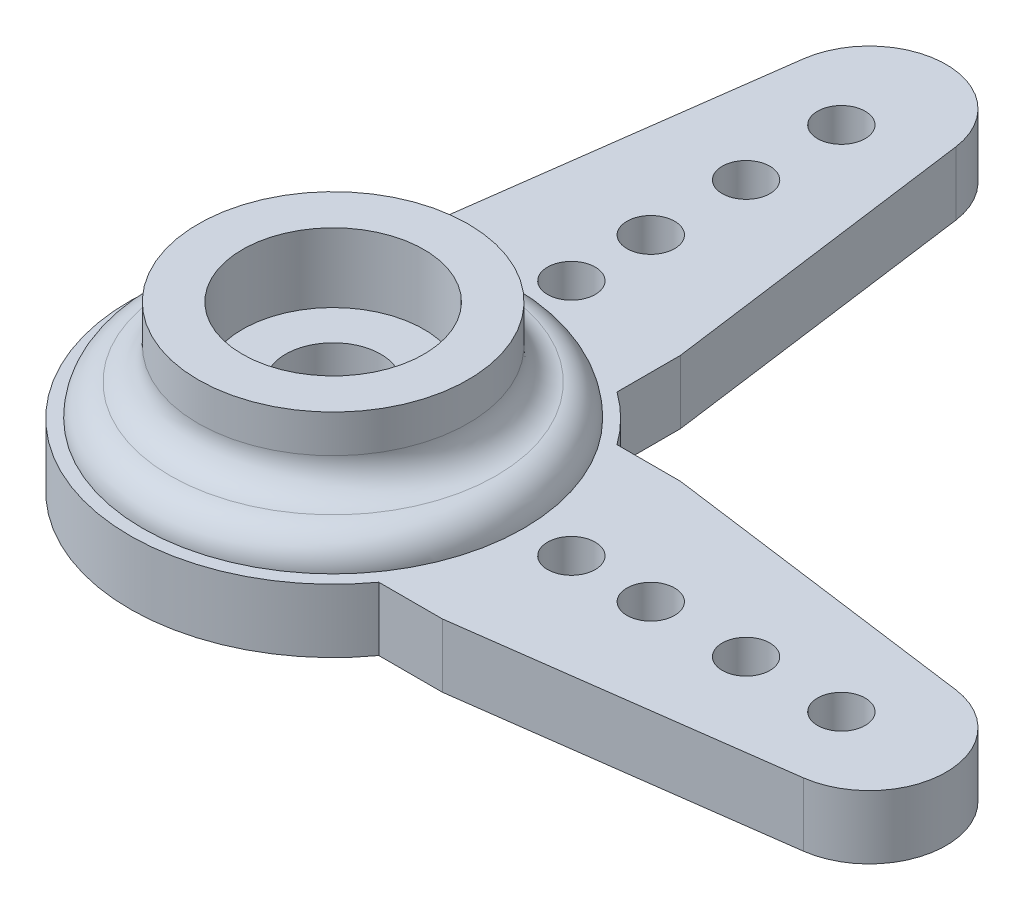
ISO-10303-21;
HEADER;
FILE_DESCRIPTION(('STEP AP214'),'2;1');
FILE_NAME('part.step','',(''),(''),'','','');
FILE_SCHEMA(('AUTOMOTIVE_DESIGN { 1 0 10303 214 1 1 1 1 }'));
ENDSEC;
DATA;
#1=APPLICATION_CONTEXT('core data for automotive mechanical design processes');
#2=APPLICATION_PROTOCOL_DEFINITION('international standard','automotive_design',2000,#1);
#3=PRODUCT_CONTEXT('',#1,'mechanical');
#4=PRODUCT('Part','Part','',(#3));
#5=PRODUCT_RELATED_PRODUCT_CATEGORY('part','',(#4));
#6=PRODUCT_DEFINITION_FORMATION('','',#4);
#7=PRODUCT_DEFINITION_CONTEXT('part definition',#1,'design');
#8=PRODUCT_DEFINITION('design','',#6,#7);
#9=PRODUCT_DEFINITION_SHAPE('','',#8);
#10=(LENGTH_UNIT() NAMED_UNIT(*) SI_UNIT(.MILLI.,.METRE.));
#11=(NAMED_UNIT(*) PLANE_ANGLE_UNIT() SI_UNIT($,.RADIAN.));
#12=(NAMED_UNIT(*) SI_UNIT($,.STERADIAN.) SOLID_ANGLE_UNIT());
#13=UNCERTAINTY_MEASURE_WITH_UNIT(LENGTH_MEASURE(1.E-05),#10,'distance_accuracy_value','');
#14=(GEOMETRIC_REPRESENTATION_CONTEXT(3) GLOBAL_UNCERTAINTY_ASSIGNED_CONTEXT((#13)) GLOBAL_UNIT_ASSIGNED_CONTEXT((#10,
#11,#12)) REPRESENTATION_CONTEXT('',''));
#15=CARTESIAN_POINT('',(0.,0.,0.));
#16=DIRECTION('',(0.,0.,1.));
#17=DIRECTION('',(1.,0.,0.));
#18=AXIS2_PLACEMENT_3D('',#15,#16,#17);
#19=CARTESIAN_POINT('',(0.,2.,0.));
#20=DIRECTION('',(0.,1.,0.));
#21=DIRECTION('',(0.,0.,1.));
#22=AXIS2_PLACEMENT_3D('',#19,#20,#21);
#23=PLANE('',#22);
#24=CARTESIAN_POINT('',(7.5,2.,0.));
#25=DIRECTION('',(0.,1.,0.));
#26=DIRECTION('',(0.,0.,1.));
#27=AXIS2_PLACEMENT_3D('',#24,#25,#26);
#28=CIRCLE('',#27,0.75);
#29=CARTESIAN_POINT('',(7.5,2.,0.750000000000026));
#30=VERTEX_POINT('',#29);
#31=EDGE_CURVE('E363',#30,#30,#28,.T.);
#32=ORIENTED_EDGE('',*,*,#31,.F.);
#33=EDGE_LOOP('',(#32));
#34=FACE_BOUND('',#33,.T.);
#35=CARTESIAN_POINT('',(13.,2.,0.));
#36=DIRECTION('',(0.,1.,0.));
#37=DIRECTION('',(0.,0.,1.));
#38=AXIS2_PLACEMENT_3D('',#35,#36,#37);
#39=CIRCLE('',#38,0.750000000000001);
#40=CARTESIAN_POINT('',(13.,2.,0.750000000000046));
#41=VERTEX_POINT('',#40);
#42=EDGE_CURVE('E351',#41,#41,#39,.T.);
#43=ORIENTED_EDGE('',*,*,#42,.F.);
#44=EDGE_LOOP('',(#43));
#45=FACE_BOUND('',#44,.T.);
#46=CARTESIAN_POINT('',(0.,2.,-7.5));
#47=DIRECTION('',(0.,1.,0.));
#48=DIRECTION('',(0.,0.,1.));
#49=AXIS2_PLACEMENT_3D('',#46,#47,#48);
#50=CIRCLE('',#49,0.75);
#51=CARTESIAN_POINT('',(0.,2.,-6.75));
#52=VERTEX_POINT('',#51);
#53=EDGE_CURVE('E339',#52,#52,#50,.T.);
#54=ORIENTED_EDGE('',*,*,#53,.F.);
#55=EDGE_LOOP('',(#54));
#56=FACE_BOUND('',#55,.T.);
#57=CARTESIAN_POINT('',(0.,2.,-13.));
#58=DIRECTION('',(0.,1.,0.));
#59=DIRECTION('',(0.,0.,1.));
#60=AXIS2_PLACEMENT_3D('',#57,#58,#59);
#61=CIRCLE('',#60,0.750000000000001);
#62=CARTESIAN_POINT('',(0.,2.,-12.25));
#63=VERTEX_POINT('',#62);
#64=EDGE_CURVE('E327',#63,#63,#61,.T.);
#65=ORIENTED_EDGE('',*,*,#64,.F.);
#66=EDGE_LOOP('',(#65));
#67=FACE_BOUND('',#66,.T.);
#68=CARTESIAN_POINT('',(0.,2.,0.));
#69=DIRECTION('',(0.,1.,0.));
#70=DIRECTION('',(0.,0.,1.));
#71=AXIS2_PLACEMENT_3D('',#68,#69,#70);
#72=CIRCLE('',#71,6.4);
#73=CARTESIAN_POINT('',(-3.75,2.,-5.18627997701628));
#74=VERTEX_POINT('',#73);
#75=CARTESIAN_POINT('',(5.18627997701627,2.,3.75000000000002));
#76=VERTEX_POINT('',#75);
#77=EDGE_CURVE('E179',#74,#76,#72,.T.);
#78=ORIENTED_EDGE('',*,*,#77,.T.);
#79=DIRECTION('',(1.,0.,0.));
#80=VECTOR('',#79,1.);
#81=CARTESIAN_POINT('',(5.18627997701627,2.,3.75000000000002));
#82=LINE('',#81,#80);
#83=CARTESIAN_POINT('',(7.18627997701627,2.,3.75000000000002));
#84=VERTEX_POINT('',#83);
#85=EDGE_CURVE('E107',#76,#84,#82,.T.);
#86=ORIENTED_EDGE('',*,*,#85,.T.);
#87=DIRECTION('',(0.99103765023662,0.,-0.1335828425116));
#88=VECTOR('',#87,1.);
#89=CARTESIAN_POINT('',(7.18627997701627,2.,3.75000000000002));
#90=LINE('',#89,#88);
#91=CARTESIAN_POINT('',(17.2017939656726,2.,2.40000000000006));
#92=VERTEX_POINT('',#91);
#93=EDGE_CURVE('E291',#84,#92,#90,.T.);
#94=ORIENTED_EDGE('',*,*,#93,.T.);
#95=CARTESIAN_POINT('',(16.8782958402973,2.,0.));
#96=DIRECTION('',(0.,1.,0.));
#97=DIRECTION('',(0.,0.,-1.));
#98=AXIS2_PLACEMENT_3D('',#95,#96,#97);
#99=CIRCLE('',#98,2.42170415970269);
#100=CARTESIAN_POINT('',(17.2017939656726,2.,-2.39999999999994));
#101=VERTEX_POINT('',#100);
#102=EDGE_CURVE('E293',#92,#101,#99,.T.);
#103=ORIENTED_EDGE('',*,*,#102,.T.);
#104=DIRECTION('',(-0.991037650236619,0.,-0.133582842511607));
#105=VECTOR('',#104,1.);
#106=CARTESIAN_POINT('',(7.18627997701629,2.,-3.74999999999997));
#107=LINE('',#106,#105);
#108=CARTESIAN_POINT('',(7.18627997701629,2.,-3.74999999999997));
#109=VERTEX_POINT('',#108);
#110=EDGE_CURVE('E295',#101,#109,#107,.T.);
#111=ORIENTED_EDGE('',*,*,#110,.T.);
#112=DIRECTION('',(-1.,0.,0.));
#113=VECTOR('',#112,1.);
#114=CARTESIAN_POINT('',(5.18627997701629,2.,-3.74999999999998));
#115=LINE('',#114,#113);
#116=CARTESIAN_POINT('',(5.18627997701629,2.,-3.74999999999998));
#117=VERTEX_POINT('',#116);
#118=EDGE_CURVE('E301',#109,#117,#115,.T.);
#119=ORIENTED_EDGE('',*,*,#118,.T.);
#120=CARTESIAN_POINT('',(0.,2.,0.));
#121=DIRECTION('',(0.,1.,0.));
#122=DIRECTION('',(0.,0.,1.));
#123=AXIS2_PLACEMENT_3D('',#120,#121,#122);
#124=CIRCLE('',#123,6.4);
#125=CARTESIAN_POINT('',(3.75,2.,-5.18627997701628));
#126=VERTEX_POINT('',#125);
#127=EDGE_CURVE('E303',#117,#126,#124,.T.);
#128=ORIENTED_EDGE('',*,*,#127,.T.);
#129=DIRECTION('',(0.,0.,-1.));
#130=VECTOR('',#129,1.);
#131=CARTESIAN_POINT('',(3.75,2.,-5.18627997701628));
#132=LINE('',#131,#130);
#133=CARTESIAN_POINT('',(3.75,2.,-7.18627997701628));
#134=VERTEX_POINT('',#133);
#135=EDGE_CURVE('E305',#126,#134,#132,.T.);
#136=ORIENTED_EDGE('',*,*,#135,.T.);
#137=DIRECTION('',(-0.133582842511604,0.,-0.991037650236619));
#138=VECTOR('',#137,1.);
#139=CARTESIAN_POINT('',(3.75,2.,-7.18627997701628));
#140=LINE('',#139,#138);
#141=CARTESIAN_POINT('',(2.4,2.,-17.2017939656726));
#142=VERTEX_POINT('',#141);
#143=EDGE_CURVE('E138',#134,#142,#140,.T.);
#144=ORIENTED_EDGE('',*,*,#143,.T.);
#145=CARTESIAN_POINT('',(0.,2.,-16.8782958402973));
#146=DIRECTION('',(0.,1.,0.));
#147=DIRECTION('',(0.,0.,-1.));
#148=AXIS2_PLACEMENT_3D('',#145,#146,#147);
#149=CIRCLE('',#148,2.42170415970269);
#150=CARTESIAN_POINT('',(-2.4,2.,-17.2017939656726));
#151=VERTEX_POINT('',#150);
#152=EDGE_CURVE('E132',#142,#151,#149,.T.);
#153=ORIENTED_EDGE('',*,*,#152,.T.);
#154=DIRECTION('',(-0.133582842511604,0.,0.991037650236619));
#155=VECTOR('',#154,1.);
#156=CARTESIAN_POINT('',(-3.75,2.,-7.18627997701628));
#157=LINE('',#156,#155);
#158=CARTESIAN_POINT('',(-3.75,2.,-7.18627997701628));
#159=VERTEX_POINT('',#158);
#160=EDGE_CURVE('E136',#151,#159,#157,.T.);
#161=ORIENTED_EDGE('',*,*,#160,.T.);
#162=DIRECTION('',(0.,0.,1.));
#163=VECTOR('',#162,1.);
#164=CARTESIAN_POINT('',(-3.75,2.,-5.18627997701628));
#165=LINE('',#164,#163);
#166=EDGE_CURVE('E51',#159,#74,#165,.T.);
#167=ORIENTED_EDGE('',*,*,#166,.T.);
#168=EDGE_LOOP('',(#78,#86,#94,#103,#111,#119,#128,#136,#144,#153,#161,#167));
#169=FACE_BOUND('',#168,.T.);
#170=CARTESIAN_POINT('',(0.,2.,-16.));
#171=DIRECTION('',(0.,1.,0.));
#172=DIRECTION('',(0.,0.,1.));
#173=AXIS2_PLACEMENT_3D('',#170,#171,#172);
#174=CIRCLE('',#173,0.750000000000001);
#175=CARTESIAN_POINT('',(0.,2.,-15.25));
#176=VERTEX_POINT('',#175);
#177=EDGE_CURVE('E323',#176,#176,#174,.T.);
#178=ORIENTED_EDGE('',*,*,#177,.F.);
#179=EDGE_LOOP('',(#178));
#180=FACE_BOUND('',#179,.T.);
#181=CARTESIAN_POINT('',(0.,2.,-10.));
#182=DIRECTION('',(0.,1.,0.));
#183=DIRECTION('',(0.,0.,1.));
#184=AXIS2_PLACEMENT_3D('',#181,#182,#183);
#185=CIRCLE('',#184,0.750000000000001);
#186=CARTESIAN_POINT('',(0.,2.,-9.25));
#187=VERTEX_POINT('',#186);
#188=EDGE_CURVE('E333',#187,#187,#185,.T.);
#189=ORIENTED_EDGE('',*,*,#188,.F.);
#190=EDGE_LOOP('',(#189));
#191=FACE_BOUND('',#190,.T.);
#192=CARTESIAN_POINT('',(16.,2.,0.));
#193=DIRECTION('',(0.,1.,0.));
#194=DIRECTION('',(0.,0.,1.));
#195=AXIS2_PLACEMENT_3D('',#192,#193,#194);
#196=CIRCLE('',#195,0.749999999999999);
#197=CARTESIAN_POINT('',(16.,2.,0.750000000000055));
#198=VERTEX_POINT('',#197);
#199=EDGE_CURVE('E345',#198,#198,#196,.T.);
#200=ORIENTED_EDGE('',*,*,#199,.F.);
#201=EDGE_LOOP('',(#200));
#202=FACE_BOUND('',#201,.T.);
#203=CARTESIAN_POINT('',(10.,2.,0.));
#204=DIRECTION('',(0.,1.,0.));
#205=DIRECTION('',(0.,0.,1.));
#206=AXIS2_PLACEMENT_3D('',#203,#204,#205);
#207=CIRCLE('',#206,0.750000000000001);
#208=CARTESIAN_POINT('',(10.,2.,0.750000000000036));
#209=VERTEX_POINT('',#208);
#210=EDGE_CURVE('E357',#209,#209,#207,.T.);
#211=ORIENTED_EDGE('',*,*,#210,.F.);
#212=EDGE_LOOP('',(#211));
#213=FACE_BOUND('',#212,.T.);
#214=CARTESIAN_POINT('',(0.,2.,0.));
#215=DIRECTION('',(0.,1.,0.));
#216=DIRECTION('',(0.,0.,1.));
#217=AXIS2_PLACEMENT_3D('',#214,#215,#216);
#218=CIRCLE('',#217,6.);
#219=CARTESIAN_POINT('',(0.,2.,6.));
#220=VERTEX_POINT('',#219);
#221=EDGE_CURVE('E377',#220,#220,#218,.T.);
#222=ORIENTED_EDGE('',*,*,#221,.F.);
#223=EDGE_LOOP('',(#222));
#224=FACE_BOUND('',#223,.T.);
#225=ADVANCED_FACE('F33',(#34,#45,#56,#67,#169,#180,#191,#202,#213,#224),#23,.T.);
#226=CARTESIAN_POINT('',(0.,0.,0.));
#227=DIRECTION('',(0.,1.,0.));
#228=DIRECTION('',(0.,0.,1.));
#229=AXIS2_PLACEMENT_3D('',#226,#227,#228);
#230=PLANE('',#229);
#231=CARTESIAN_POINT('',(10.,0.,0.));
#232=DIRECTION('',(0.,1.,0.));
#233=DIRECTION('',(0.,0.,1.));
#234=AXIS2_PLACEMENT_3D('',#231,#232,#233);
#235=CIRCLE('',#234,0.750000000000001);
#236=CARTESIAN_POINT('',(10.,0.,0.750000000000036));
#237=VERTEX_POINT('',#236);
#238=EDGE_CURVE('E360',#237,#237,#235,.T.);
#239=ORIENTED_EDGE('',*,*,#238,.T.);
#240=EDGE_LOOP('',(#239));
#241=FACE_BOUND('',#240,.T.);
#242=CARTESIAN_POINT('',(16.,0.,0.));
#243=DIRECTION('',(0.,1.,0.));
#244=DIRECTION('',(0.,0.,1.));
#245=AXIS2_PLACEMENT_3D('',#242,#243,#244);
#246=CIRCLE('',#245,0.749999999999999);
#247=CARTESIAN_POINT('',(16.,0.,0.750000000000055));
#248=VERTEX_POINT('',#247);
#249=EDGE_CURVE('E348',#248,#248,#246,.T.);
#250=ORIENTED_EDGE('',*,*,#249,.T.);
#251=EDGE_LOOP('',(#250));
#252=FACE_BOUND('',#251,.T.);
#253=CARTESIAN_POINT('',(0.,0.,-10.));
#254=DIRECTION('',(0.,1.,0.));
#255=DIRECTION('',(0.,0.,1.));
#256=AXIS2_PLACEMENT_3D('',#253,#254,#255);
#257=CIRCLE('',#256,0.750000000000001);
#258=CARTESIAN_POINT('',(0.,0.,-9.25));
#259=VERTEX_POINT('',#258);
#260=EDGE_CURVE('E336',#259,#259,#257,.T.);
#261=ORIENTED_EDGE('',*,*,#260,.T.);
#262=EDGE_LOOP('',(#261));
#263=FACE_BOUND('',#262,.T.);
#264=CARTESIAN_POINT('',(0.,0.,-16.));
#265=DIRECTION('',(0.,1.,0.));
#266=DIRECTION('',(0.,0.,1.));
#267=AXIS2_PLACEMENT_3D('',#264,#265,#266);
#268=CIRCLE('',#267,0.750000000000001);
#269=CARTESIAN_POINT('',(0.,0.,-15.25));
#270=VERTEX_POINT('',#269);
#271=EDGE_CURVE('E324',#270,#270,#268,.T.);
#272=ORIENTED_EDGE('',*,*,#271,.T.);
#273=EDGE_LOOP('',(#272));
#274=FACE_BOUND('',#273,.T.);
#275=CARTESIAN_POINT('',(0.,0.,0.));
#276=DIRECTION('',(0.,1.,0.));
#277=DIRECTION('',(0.,0.,1.));
#278=AXIS2_PLACEMENT_3D('',#275,#276,#277);
#279=CIRCLE('',#278,6.4);
#280=CARTESIAN_POINT('',(-3.75,0.,-5.18627997701628));
#281=VERTEX_POINT('',#280);
#282=CARTESIAN_POINT('',(5.18627997701627,0.,3.75000000000002));
#283=VERTEX_POINT('',#282);
#284=EDGE_CURVE('E156',#281,#283,#279,.T.);
#285=ORIENTED_EDGE('',*,*,#284,.F.);
#286=DIRECTION('',(0.,0.,1.));
#287=VECTOR('',#286,1.);
#288=CARTESIAN_POINT('',(-3.75,0.,-5.18627997701628));
#289=LINE('',#288,#287);
#290=CARTESIAN_POINT('',(-3.75,0.,-7.18627997701628));
#291=VERTEX_POINT('',#290);
#292=EDGE_CURVE('E98',#291,#281,#289,.T.);
#293=ORIENTED_EDGE('',*,*,#292,.F.);
#294=DIRECTION('',(-0.133582842511604,0.,0.991037650236619));
#295=VECTOR('',#294,1.);
#296=CARTESIAN_POINT('',(-3.75,0.,-7.18627997701628));
#297=LINE('',#296,#295);
#298=CARTESIAN_POINT('',(-2.4,0.,-17.2017939656726));
#299=VERTEX_POINT('',#298);
#300=EDGE_CURVE('E92',#299,#291,#297,.T.);
#301=ORIENTED_EDGE('',*,*,#300,.F.);
#302=CARTESIAN_POINT('',(0.,0.,-16.8782958402973));
#303=DIRECTION('',(0.,1.,0.));
#304=DIRECTION('',(0.,0.,-1.));
#305=AXIS2_PLACEMENT_3D('',#302,#303,#304);
#306=CIRCLE('',#305,2.42170415970269);
#307=CARTESIAN_POINT('',(2.4,0.,-17.2017939656726));
#308=VERTEX_POINT('',#307);
#309=EDGE_CURVE('E146',#308,#299,#306,.T.);
#310=ORIENTED_EDGE('',*,*,#309,.F.);
#311=DIRECTION('',(-0.133582842511604,0.,-0.991037650236619));
#312=VECTOR('',#311,1.);
#313=CARTESIAN_POINT('',(3.75,0.,-7.18627997701628));
#314=LINE('',#313,#312);
#315=CARTESIAN_POINT('',(3.75,0.,-7.18627997701628));
#316=VERTEX_POINT('',#315);
#317=EDGE_CURVE('E174',#316,#308,#314,.T.);
#318=ORIENTED_EDGE('',*,*,#317,.F.);
#319=DIRECTION('',(0.,0.,-1.));
#320=VECTOR('',#319,1.);
#321=CARTESIAN_POINT('',(3.75,0.,-5.18627997701628));
#322=LINE('',#321,#320);
#323=CARTESIAN_POINT('',(3.75,0.,-5.18627997701628));
#324=VERTEX_POINT('',#323);
#325=EDGE_CURVE('E172',#324,#316,#322,.T.);
#326=ORIENTED_EDGE('',*,*,#325,.F.);
#327=CARTESIAN_POINT('',(0.,0.,0.));
#328=DIRECTION('',(0.,1.,0.));
#329=DIRECTION('',(0.,0.,1.));
#330=AXIS2_PLACEMENT_3D('',#327,#328,#329);
#331=CIRCLE('',#330,6.4);
#332=CARTESIAN_POINT('',(5.18627997701629,0.,-3.74999999999998));
#333=VERTEX_POINT('',#332);
#334=EDGE_CURVE('E170',#333,#324,#331,.T.);
#335=ORIENTED_EDGE('',*,*,#334,.F.);
#336=DIRECTION('',(-1.,0.,0.));
#337=VECTOR('',#336,1.);
#338=CARTESIAN_POINT('',(5.18627997701629,0.,-3.74999999999998));
#339=LINE('',#338,#337);
#340=CARTESIAN_POINT('',(7.18627997701629,0.,-3.74999999999997));
#341=VERTEX_POINT('',#340);
#342=EDGE_CURVE('E168',#341,#333,#339,.T.);
#343=ORIENTED_EDGE('',*,*,#342,.F.);
#344=DIRECTION('',(-0.991037650236619,0.,-0.133582842511607));
#345=VECTOR('',#344,1.);
#346=CARTESIAN_POINT('',(7.18627997701629,0.,-3.74999999999997));
#347=LINE('',#346,#345);
#348=CARTESIAN_POINT('',(17.2017939656726,0.,-2.39999999999994));
#349=VERTEX_POINT('',#348);
#350=EDGE_CURVE('E166',#349,#341,#347,.T.);
#351=ORIENTED_EDGE('',*,*,#350,.F.);
#352=CARTESIAN_POINT('',(16.8782958402973,0.,0.));
#353=DIRECTION('',(0.,1.,0.));
#354=DIRECTION('',(0.,0.,-1.));
#355=AXIS2_PLACEMENT_3D('',#352,#353,#354);
#356=CIRCLE('',#355,2.42170415970269);
#357=CARTESIAN_POINT('',(17.2017939656726,0.,2.40000000000006));
#358=VERTEX_POINT('',#357);
#359=EDGE_CURVE('E164',#358,#349,#356,.T.);
#360=ORIENTED_EDGE('',*,*,#359,.F.);
#361=DIRECTION('',(0.99103765023662,0.,-0.1335828425116));
#362=VECTOR('',#361,1.);
#363=CARTESIAN_POINT('',(7.18627997701627,0.,3.75000000000002));
#364=LINE('',#363,#362);
#365=CARTESIAN_POINT('',(7.18627997701627,0.,3.75000000000002));
#366=VERTEX_POINT('',#365);
#367=EDGE_CURVE('E162',#366,#358,#364,.T.);
#368=ORIENTED_EDGE('',*,*,#367,.F.);
#369=DIRECTION('',(1.,0.,0.));
#370=VECTOR('',#369,1.);
#371=CARTESIAN_POINT('',(5.18627997701627,0.,3.75000000000002));
#372=LINE('',#371,#370);
#373=EDGE_CURVE('E159',#283,#366,#372,.T.);
#374=ORIENTED_EDGE('',*,*,#373,.F.);
#375=EDGE_LOOP('',(#285,#293,#301,#310,#318,#326,#335,#343,#351,#360,#368,#374));
#376=FACE_BOUND('',#375,.T.);
#377=CARTESIAN_POINT('',(0.,0.,0.));
#378=DIRECTION('',(0.,1.,0.));
#379=DIRECTION('',(0.,0.,1.));
#380=AXIS2_PLACEMENT_3D('',#377,#378,#379);
#381=CIRCLE('',#380,1.5);
#382=CARTESIAN_POINT('',(0.,0.,1.5));
#383=VERTEX_POINT('',#382);
#384=EDGE_CURVE('E160',#383,#383,#381,.T.);
#385=ORIENTED_EDGE('',*,*,#384,.T.);
#386=EDGE_LOOP('',(#385));
#387=FACE_BOUND('',#386,.T.);
#388=CARTESIAN_POINT('',(0.,0.,-13.));
#389=DIRECTION('',(0.,1.,0.));
#390=DIRECTION('',(0.,0.,1.));
#391=AXIS2_PLACEMENT_3D('',#388,#389,#390);
#392=CIRCLE('',#391,0.750000000000001);
#393=CARTESIAN_POINT('',(0.,0.,-12.25));
#394=VERTEX_POINT('',#393);
#395=EDGE_CURVE('E330',#394,#394,#392,.T.);
#396=ORIENTED_EDGE('',*,*,#395,.T.);
#397=EDGE_LOOP('',(#396));
#398=FACE_BOUND('',#397,.T.);
#399=CARTESIAN_POINT('',(0.,0.,-7.5));
#400=DIRECTION('',(0.,1.,0.));
#401=DIRECTION('',(0.,0.,1.));
#402=AXIS2_PLACEMENT_3D('',#399,#400,#401);
#403=CIRCLE('',#402,0.75);
#404=CARTESIAN_POINT('',(0.,0.,-6.75));
#405=VERTEX_POINT('',#404);
#406=EDGE_CURVE('E342',#405,#405,#403,.T.);
#407=ORIENTED_EDGE('',*,*,#406,.T.);
#408=EDGE_LOOP('',(#407));
#409=FACE_BOUND('',#408,.T.);
#410=CARTESIAN_POINT('',(13.,0.,0.));
#411=DIRECTION('',(0.,1.,0.));
#412=DIRECTION('',(0.,0.,1.));
#413=AXIS2_PLACEMENT_3D('',#410,#411,#412);
#414=CIRCLE('',#413,0.750000000000001);
#415=CARTESIAN_POINT('',(13.,0.,0.750000000000046));
#416=VERTEX_POINT('',#415);
#417=EDGE_CURVE('E354',#416,#416,#414,.T.);
#418=ORIENTED_EDGE('',*,*,#417,.T.);
#419=EDGE_LOOP('',(#418));
#420=FACE_BOUND('',#419,.T.);
#421=CARTESIAN_POINT('',(7.5,0.,0.));
#422=DIRECTION('',(0.,1.,0.));
#423=DIRECTION('',(0.,0.,1.));
#424=AXIS2_PLACEMENT_3D('',#421,#422,#423);
#425=CIRCLE('',#424,0.75);
#426=CARTESIAN_POINT('',(7.5,0.,0.750000000000026));
#427=VERTEX_POINT('',#426);
#428=EDGE_CURVE('E366',#427,#427,#425,.T.);
#429=ORIENTED_EDGE('',*,*,#428,.T.);
#430=EDGE_LOOP('',(#429));
#431=FACE_BOUND('',#430,.T.);
#432=ADVANCED_FACE('F225',(#241,#252,#263,#274,#376,#387,#398,#409,#420,#431),#230,.F.);
#433=CARTESIAN_POINT('',(0.,2.,0.));
#434=DIRECTION('',(0.,-1.,0.));
#435=DIRECTION('',(0.,0.,-1.));
#436=AXIS2_PLACEMENT_3D('',#433,#434,#435);
#437=CYLINDRICAL_SURFACE('',#436,6.4);
#438=ORIENTED_EDGE('',*,*,#284,.T.);
#439=DIRECTION('',(0.,-1.,0.));
#440=VECTOR('',#439,1.);
#441=CARTESIAN_POINT('',(5.18627997701627,2.,3.75000000000002));
#442=LINE('',#441,#440);
#443=EDGE_CURVE('E204',#76,#283,#442,.T.);
#444=ORIENTED_EDGE('',*,*,#443,.F.);
#445=ORIENTED_EDGE('',*,*,#77,.F.);
#446=DIRECTION('',(0.,-1.,0.));
#447=VECTOR('',#446,1.);
#448=CARTESIAN_POINT('',(-3.75,2.,-5.18627997701628));
#449=LINE('',#448,#447);
#450=EDGE_CURVE('E152',#74,#281,#449,.T.);
#451=ORIENTED_EDGE('',*,*,#450,.T.);
#452=EDGE_LOOP('',(#438,#444,#445,#451));
#453=FACE_BOUND('',#452,.T.);
#454=ADVANCED_FACE('F231',(#453),#437,.T.);
#455=CARTESIAN_POINT('',(5.18627997701627,2.,3.75000000000002));
#456=DIRECTION('',(0.,0.,-1.));
#457=DIRECTION('',(-1.,0.,0.));
#458=AXIS2_PLACEMENT_3D('',#455,#456,#457);
#459=PLANE('',#458);
#460=ORIENTED_EDGE('',*,*,#373,.T.);
#461=DIRECTION('',(0.,-1.,0.));
#462=VECTOR('',#461,1.);
#463=CARTESIAN_POINT('',(7.18627997701627,2.,3.75000000000002));
#464=LINE('',#463,#462);
#465=EDGE_CURVE('E201',#84,#366,#464,.T.);
#466=ORIENTED_EDGE('',*,*,#465,.F.);
#467=ORIENTED_EDGE('',*,*,#85,.F.);
#468=ORIENTED_EDGE('',*,*,#443,.T.);
#469=EDGE_LOOP('',(#460,#466,#467,#468));
#470=FACE_BOUND('',#469,.T.);
#471=ADVANCED_FACE('F274',(#470),#459,.F.);
#472=CARTESIAN_POINT('',(7.18627997701627,2.,3.75000000000002));
#473=DIRECTION('',(-0.1335828425116,0.,-0.99103765023662));
#474=DIRECTION('',(-0.99103765023662,0.,0.1335828425116));
#475=AXIS2_PLACEMENT_3D('',#472,#473,#474);
#476=PLANE('',#475);
#477=ORIENTED_EDGE('',*,*,#367,.T.);
#478=DIRECTION('',(0.,-1.,0.));
#479=VECTOR('',#478,1.);
#480=CARTESIAN_POINT('',(17.2017939656726,2.,2.40000000000006));
#481=LINE('',#480,#479);
#482=EDGE_CURVE('E198',#92,#358,#481,.T.);
#483=ORIENTED_EDGE('',*,*,#482,.F.);
#484=ORIENTED_EDGE('',*,*,#93,.F.);
#485=ORIENTED_EDGE('',*,*,#465,.T.);
#486=EDGE_LOOP('',(#477,#483,#484,#485));
#487=FACE_BOUND('',#486,.T.);
#488=ADVANCED_FACE('F270',(#487),#476,.F.);
#489=CARTESIAN_POINT('',(16.8782958402973,2.,0.));
#490=DIRECTION('',(0.,-1.,0.));
#491=DIRECTION('',(0.,0.,-1.));
#492=AXIS2_PLACEMENT_3D('',#489,#490,#491);
#493=CYLINDRICAL_SURFACE('',#492,2.42170415970269);
#494=ORIENTED_EDGE('',*,*,#359,.T.);
#495=DIRECTION('',(0.,-1.,0.));
#496=VECTOR('',#495,1.);
#497=CARTESIAN_POINT('',(17.2017939656726,2.,-2.39999999999994));
#498=LINE('',#497,#496);
#499=EDGE_CURVE('E195',#101,#349,#498,.T.);
#500=ORIENTED_EDGE('',*,*,#499,.F.);
#501=ORIENTED_EDGE('',*,*,#102,.F.);
#502=ORIENTED_EDGE('',*,*,#482,.T.);
#503=EDGE_LOOP('',(#494,#500,#501,#502));
#504=FACE_BOUND('',#503,.T.);
#505=ADVANCED_FACE('F266',(#504),#493,.T.);
#506=CARTESIAN_POINT('',(7.18627997701629,2.,-3.74999999999997));
#507=DIRECTION('',(-0.133582842511607,0.,0.991037650236619));
#508=DIRECTION('',(0.991037650236619,0.,0.133582842511607));
#509=AXIS2_PLACEMENT_3D('',#506,#507,#508);
#510=PLANE('',#509);
#511=ORIENTED_EDGE('',*,*,#350,.T.);
#512=DIRECTION('',(0.,-1.,0.));
#513=VECTOR('',#512,1.);
#514=CARTESIAN_POINT('',(7.18627997701629,2.,-3.74999999999997));
#515=LINE('',#514,#513);
#516=EDGE_CURVE('E192',#109,#341,#515,.T.);
#517=ORIENTED_EDGE('',*,*,#516,.F.);
#518=ORIENTED_EDGE('',*,*,#110,.F.);
#519=ORIENTED_EDGE('',*,*,#499,.T.);
#520=EDGE_LOOP('',(#511,#517,#518,#519));
#521=FACE_BOUND('',#520,.T.);
#522=ADVANCED_FACE('F262',(#521),#510,.F.);
#523=CARTESIAN_POINT('',(5.18627997701629,2.,-3.74999999999998));
#524=DIRECTION('',(0.,0.,1.));
#525=DIRECTION('',(1.,0.,0.));
#526=AXIS2_PLACEMENT_3D('',#523,#524,#525);
#527=PLANE('',#526);
#528=ORIENTED_EDGE('',*,*,#342,.T.);
#529=DIRECTION('',(0.,-1.,0.));
#530=VECTOR('',#529,1.);
#531=CARTESIAN_POINT('',(5.18627997701629,2.,-3.74999999999998));
#532=LINE('',#531,#530);
#533=EDGE_CURVE('E189',#117,#333,#532,.T.);
#534=ORIENTED_EDGE('',*,*,#533,.F.);
#535=ORIENTED_EDGE('',*,*,#118,.F.);
#536=ORIENTED_EDGE('',*,*,#516,.T.);
#537=EDGE_LOOP('',(#528,#534,#535,#536));
#538=FACE_BOUND('',#537,.T.);
#539=ADVANCED_FACE('F258',(#538),#527,.F.);
#540=CARTESIAN_POINT('',(0.,2.,0.));
#541=DIRECTION('',(0.,-1.,0.));
#542=DIRECTION('',(0.,0.,-1.));
#543=AXIS2_PLACEMENT_3D('',#540,#541,#542);
#544=CYLINDRICAL_SURFACE('',#543,6.4);
#545=ORIENTED_EDGE('',*,*,#334,.T.);
#546=DIRECTION('',(0.,-1.,0.));
#547=VECTOR('',#546,1.);
#548=CARTESIAN_POINT('',(3.75,2.,-5.18627997701628));
#549=LINE('',#548,#547);
#550=EDGE_CURVE('E186',#126,#324,#549,.T.);
#551=ORIENTED_EDGE('',*,*,#550,.F.);
#552=ORIENTED_EDGE('',*,*,#127,.F.);
#553=ORIENTED_EDGE('',*,*,#533,.T.);
#554=EDGE_LOOP('',(#545,#551,#552,#553));
#555=FACE_BOUND('',#554,.T.);
#556=ADVANCED_FACE('F254',(#555),#544,.T.);
#557=CARTESIAN_POINT('',(3.75,2.,-5.18627997701628));
#558=DIRECTION('',(-1.,0.,0.));
#559=DIRECTION('',(0.,0.,1.));
#560=AXIS2_PLACEMENT_3D('',#557,#558,#559);
#561=PLANE('',#560);
#562=ORIENTED_EDGE('',*,*,#325,.T.);
#563=DIRECTION('',(0.,-1.,0.));
#564=VECTOR('',#563,1.);
#565=CARTESIAN_POINT('',(3.75,2.,-7.18627997701628));
#566=LINE('',#565,#564);
#567=EDGE_CURVE('E183',#134,#316,#566,.T.);
#568=ORIENTED_EDGE('',*,*,#567,.F.);
#569=ORIENTED_EDGE('',*,*,#135,.F.);
#570=ORIENTED_EDGE('',*,*,#550,.T.);
#571=EDGE_LOOP('',(#562,#568,#569,#570));
#572=FACE_BOUND('',#571,.T.);
#573=ADVANCED_FACE('F250',(#572),#561,.F.);
#574=CARTESIAN_POINT('',(3.75,2.,-7.18627997701628));
#575=DIRECTION('',(-0.991037650236619,0.,0.133582842511604));
#576=DIRECTION('',(0.133582842511604,0.,0.991037650236619));
#577=AXIS2_PLACEMENT_3D('',#574,#575,#576);
#578=PLANE('',#577);
#579=ORIENTED_EDGE('',*,*,#317,.T.);
#580=DIRECTION('',(0.,-1.,0.));
#581=VECTOR('',#580,1.);
#582=CARTESIAN_POINT('',(2.4,2.,-17.2017939656726));
#583=LINE('',#582,#581);
#584=EDGE_CURVE('E147',#142,#308,#583,.T.);
#585=ORIENTED_EDGE('',*,*,#584,.F.);
#586=ORIENTED_EDGE('',*,*,#143,.F.);
#587=ORIENTED_EDGE('',*,*,#567,.T.);
#588=EDGE_LOOP('',(#579,#585,#586,#587));
#589=FACE_BOUND('',#588,.T.);
#590=ADVANCED_FACE('F247',(#589),#578,.F.);
#591=CARTESIAN_POINT('',(0.,2.,-16.8782958402973));
#592=DIRECTION('',(0.,-1.,0.));
#593=DIRECTION('',(0.,0.,-1.));
#594=AXIS2_PLACEMENT_3D('',#591,#592,#593);
#595=CYLINDRICAL_SURFACE('',#594,2.42170415970269);
#596=ORIENTED_EDGE('',*,*,#309,.T.);
#597=DIRECTION('',(0.,-1.,0.));
#598=VECTOR('',#597,1.);
#599=CARTESIAN_POINT('',(-2.4,2.,-17.2017939656726));
#600=LINE('',#599,#598);
#601=EDGE_CURVE('E143',#151,#299,#600,.T.);
#602=ORIENTED_EDGE('',*,*,#601,.F.);
#603=ORIENTED_EDGE('',*,*,#152,.F.);
#604=ORIENTED_EDGE('',*,*,#584,.T.);
#605=EDGE_LOOP('',(#596,#602,#603,#604));
#606=FACE_BOUND('',#605,.T.);
#607=ADVANCED_FACE('F144',(#606),#595,.T.);
#608=CARTESIAN_POINT('',(-3.75,2.,-7.18627997701628));
#609=DIRECTION('',(0.991037650236619,0.,0.133582842511604));
#610=DIRECTION('',(0.133582842511604,0.,-0.991037650236619));
#611=AXIS2_PLACEMENT_3D('',#608,#609,#610);
#612=PLANE('',#611);
#613=ORIENTED_EDGE('',*,*,#300,.T.);
#614=DIRECTION('',(0.,-1.,0.));
#615=VECTOR('',#614,1.);
#616=CARTESIAN_POINT('',(-3.75,2.,-7.18627997701628));
#617=LINE('',#616,#615);
#618=EDGE_CURVE('E148',#159,#291,#617,.T.);
#619=ORIENTED_EDGE('',*,*,#618,.F.);
#620=ORIENTED_EDGE('',*,*,#160,.F.);
#621=ORIENTED_EDGE('',*,*,#601,.T.);
#622=EDGE_LOOP('',(#613,#619,#620,#621));
#623=FACE_BOUND('',#622,.T.);
#624=ADVANCED_FACE('F150',(#623),#612,.F.);
#625=CARTESIAN_POINT('',(-3.75,2.,-5.18627997701628));
#626=DIRECTION('',(1.,0.,0.));
#627=DIRECTION('',(0.,0.,-1.));
#628=AXIS2_PLACEMENT_3D('',#625,#626,#627);
#629=PLANE('',#628);
#630=ORIENTED_EDGE('',*,*,#292,.T.);
#631=ORIENTED_EDGE('',*,*,#450,.F.);
#632=ORIENTED_EDGE('',*,*,#166,.F.);
#633=ORIENTED_EDGE('',*,*,#618,.T.);
#634=EDGE_LOOP('',(#630,#631,#632,#633));
#635=FACE_BOUND('',#634,.T.);
#636=ADVANCED_FACE('F240',(#635),#629,.F.);
#637=CARTESIAN_POINT('',(0.,2.,0.));
#638=DIRECTION('',(0.,-1.,0.));
#639=DIRECTION('',(0.,0.,-1.));
#640=AXIS2_PLACEMENT_3D('',#637,#638,#639);
#641=CYLINDRICAL_SURFACE('',#640,1.5);
#642=ORIENTED_EDGE('',*,*,#384,.F.);
#643=EDGE_LOOP('',(#642));
#644=FACE_BOUND('',#643,.T.);
#645=CARTESIAN_POINT('',(0.,3.,0.));
#646=DIRECTION('',(0.,1.,0.));
#647=DIRECTION('',(0.,0.,1.));
#648=AXIS2_PLACEMENT_3D('',#645,#646,#647);
#649=CIRCLE('',#648,1.5);
#650=CARTESIAN_POINT('',(0.,3.,1.5));
#651=VERTEX_POINT('',#650);
#652=EDGE_CURVE('E37',#651,#651,#649,.T.);
#653=ORIENTED_EDGE('',*,*,#652,.T.);
#654=EDGE_LOOP('',(#653));
#655=FACE_BOUND('',#654,.T.);
#656=ADVANCED_FACE('F237',(#644,#655),#641,.F.);
#657=CARTESIAN_POINT('',(0.,2.,-16.));
#658=DIRECTION('',(0.,-1.,0.));
#659=DIRECTION('',(0.,0.,-1.));
#660=AXIS2_PLACEMENT_3D('',#657,#658,#659);
#661=CYLINDRICAL_SURFACE('',#660,0.750000000000001);
#662=ORIENTED_EDGE('',*,*,#177,.T.);
#663=EDGE_LOOP('',(#662));
#664=FACE_BOUND('',#663,.T.);
#665=ORIENTED_EDGE('',*,*,#271,.F.);
#666=EDGE_LOOP('',(#665));
#667=FACE_BOUND('',#666,.T.);
#668=ADVANCED_FACE('F431',(#664,#667),#661,.F.);
#669=CARTESIAN_POINT('',(0.,2.,-13.));
#670=DIRECTION('',(0.,-1.,0.));
#671=DIRECTION('',(0.,0.,-1.));
#672=AXIS2_PLACEMENT_3D('',#669,#670,#671);
#673=CYLINDRICAL_SURFACE('',#672,0.750000000000001);
#674=ORIENTED_EDGE('',*,*,#64,.T.);
#675=EDGE_LOOP('',(#674));
#676=FACE_BOUND('',#675,.T.);
#677=ORIENTED_EDGE('',*,*,#395,.F.);
#678=EDGE_LOOP('',(#677));
#679=FACE_BOUND('',#678,.T.);
#680=ADVANCED_FACE('F428',(#676,#679),#673,.F.);
#681=CARTESIAN_POINT('',(0.,2.,-10.));
#682=DIRECTION('',(0.,-1.,0.));
#683=DIRECTION('',(0.,0.,-1.));
#684=AXIS2_PLACEMENT_3D('',#681,#682,#683);
#685=CYLINDRICAL_SURFACE('',#684,0.750000000000001);
#686=ORIENTED_EDGE('',*,*,#188,.T.);
#687=EDGE_LOOP('',(#686));
#688=FACE_BOUND('',#687,.T.);
#689=ORIENTED_EDGE('',*,*,#260,.F.);
#690=EDGE_LOOP('',(#689));
#691=FACE_BOUND('',#690,.T.);
#692=ADVANCED_FACE('F424',(#688,#691),#685,.F.);
#693=CARTESIAN_POINT('',(0.,2.,-7.5));
#694=DIRECTION('',(0.,-1.,0.));
#695=DIRECTION('',(0.,0.,-1.));
#696=AXIS2_PLACEMENT_3D('',#693,#694,#695);
#697=CYLINDRICAL_SURFACE('',#696,0.75);
#698=ORIENTED_EDGE('',*,*,#53,.T.);
#699=EDGE_LOOP('',(#698));
#700=FACE_BOUND('',#699,.T.);
#701=ORIENTED_EDGE('',*,*,#406,.F.);
#702=EDGE_LOOP('',(#701));
#703=FACE_BOUND('',#702,.T.);
#704=ADVANCED_FACE('F420',(#700,#703),#697,.F.);
#705=CARTESIAN_POINT('',(16.,2.,0.));
#706=DIRECTION('',(0.,-1.,0.));
#707=DIRECTION('',(0.,0.,-1.));
#708=AXIS2_PLACEMENT_3D('',#705,#706,#707);
#709=CYLINDRICAL_SURFACE('',#708,0.749999999999999);
#710=ORIENTED_EDGE('',*,*,#199,.T.);
#711=EDGE_LOOP('',(#710));
#712=FACE_BOUND('',#711,.T.);
#713=ORIENTED_EDGE('',*,*,#249,.F.);
#714=EDGE_LOOP('',(#713));
#715=FACE_BOUND('',#714,.T.);
#716=ADVANCED_FACE('F416',(#712,#715),#709,.F.);
#717=CARTESIAN_POINT('',(13.,2.,0.));
#718=DIRECTION('',(0.,-1.,0.));
#719=DIRECTION('',(0.,0.,-1.));
#720=AXIS2_PLACEMENT_3D('',#717,#718,#719);
#721=CYLINDRICAL_SURFACE('',#720,0.750000000000001);
#722=ORIENTED_EDGE('',*,*,#42,.T.);
#723=EDGE_LOOP('',(#722));
#724=FACE_BOUND('',#723,.T.);
#725=ORIENTED_EDGE('',*,*,#417,.F.);
#726=EDGE_LOOP('',(#725));
#727=FACE_BOUND('',#726,.T.);
#728=ADVANCED_FACE('F412',(#724,#727),#721,.F.);
#729=CARTESIAN_POINT('',(10.,2.,0.));
#730=DIRECTION('',(0.,-1.,0.));
#731=DIRECTION('',(0.,0.,-1.));
#732=AXIS2_PLACEMENT_3D('',#729,#730,#731);
#733=CYLINDRICAL_SURFACE('',#732,0.750000000000001);
#734=ORIENTED_EDGE('',*,*,#210,.T.);
#735=EDGE_LOOP('',(#734));
#736=FACE_BOUND('',#735,.T.);
#737=ORIENTED_EDGE('',*,*,#238,.F.);
#738=EDGE_LOOP('',(#737));
#739=FACE_BOUND('',#738,.T.);
#740=ADVANCED_FACE('F408',(#736,#739),#733,.F.);
#741=CARTESIAN_POINT('',(7.5,2.,0.));
#742=DIRECTION('',(0.,-1.,0.));
#743=DIRECTION('',(0.,0.,-1.));
#744=AXIS2_PLACEMENT_3D('',#741,#742,#743);
#745=CYLINDRICAL_SURFACE('',#744,0.75);
#746=ORIENTED_EDGE('',*,*,#31,.T.);
#747=EDGE_LOOP('',(#746));
#748=FACE_BOUND('',#747,.T.);
#749=ORIENTED_EDGE('',*,*,#428,.F.);
#750=EDGE_LOOP('',(#749));
#751=FACE_BOUND('',#750,.T.);
#752=ADVANCED_FACE('F403',(#748,#751),#745,.F.);
#753=CARTESIAN_POINT('',(0.,5.175,0.));
#754=DIRECTION('',(0.,-1.,0.));
#755=DIRECTION('',(0.,0.,-1.));
#756=AXIS2_PLACEMENT_3D('',#753,#754,#755);
#757=CYLINDRICAL_SURFACE('',#756,4.25);
#758=CARTESIAN_POINT('',(0.,3.98431348329844,0.));
#759=DIRECTION('',(0.,1.,0.));
#760=DIRECTION('',(0.,0.,1.));
#761=AXIS2_PLACEMENT_3D('',#758,#759,#760);
#762=CIRCLE('',#761,4.25);
#763=CARTESIAN_POINT('',(0.,3.98431348329844,4.25));
#764=VERTEX_POINT('',#763);
#765=EDGE_CURVE('E43',#764,#764,#762,.T.);
#766=ORIENTED_EDGE('',*,*,#765,.T.);
#767=EDGE_LOOP('',(#766));
#768=FACE_BOUND('',#767,.T.);
#769=CARTESIAN_POINT('',(0.,5.175,0.));
#770=DIRECTION('',(0.,1.,0.));
#771=DIRECTION('',(0.,0.,1.));
#772=AXIS2_PLACEMENT_3D('',#769,#770,#771);
#773=CIRCLE('',#772,4.25);
#774=CARTESIAN_POINT('',(0.,5.175,4.25));
#775=VERTEX_POINT('',#774);
#776=EDGE_CURVE('E369',#775,#775,#773,.T.);
#777=ORIENTED_EDGE('',*,*,#776,.F.);
#778=EDGE_LOOP('',(#777));
#779=FACE_BOUND('',#778,.T.);
#780=ADVANCED_FACE('F212',(#768,#779),#757,.T.);
#781=CARTESIAN_POINT('',(0.,5.175,0.));
#782=DIRECTION('',(0.,1.,0.));
#783=DIRECTION('',(0.,0.,1.));
#784=AXIS2_PLACEMENT_3D('',#781,#782,#783);
#785=PLANE('',#784);
#786=ORIENTED_EDGE('',*,*,#776,.T.);
#787=EDGE_LOOP('',(#786));
#788=FACE_BOUND('',#787,.T.);
#789=CARTESIAN_POINT('',(0.,5.175,0.));
#790=DIRECTION('',(0.,1.,0.));
#791=DIRECTION('',(0.,0.,1.));
#792=AXIS2_PLACEMENT_3D('',#789,#790,#791);
#793=CIRCLE('',#792,2.8575);
#794=CARTESIAN_POINT('',(0.,5.175,2.8575));
#795=VERTEX_POINT('',#794);
#796=EDGE_CURVE('E374',#795,#795,#793,.T.);
#797=ORIENTED_EDGE('',*,*,#796,.F.);
#798=EDGE_LOOP('',(#797));
#799=FACE_BOUND('',#798,.T.);
#800=ADVANCED_FACE('F393',(#788,#799),#785,.T.);
#801=CARTESIAN_POINT('',(0.,5.175,0.));
#802=DIRECTION('',(0.,-1.,0.));
#803=DIRECTION('',(0.,0.,-1.));
#804=AXIS2_PLACEMENT_3D('',#801,#802,#803);
#805=CYLINDRICAL_SURFACE('',#804,2.8575);
#806=CARTESIAN_POINT('',(0.,3.,0.));
#807=DIRECTION('',(0.,1.,0.));
#808=DIRECTION('',(0.,0.,1.));
#809=AXIS2_PLACEMENT_3D('',#806,#807,#808);
#810=CIRCLE('',#809,2.8575);
#811=CARTESIAN_POINT('',(0.,3.,2.8575));
#812=VERTEX_POINT('',#811);
#813=EDGE_CURVE('E206',#812,#812,#810,.T.);
#814=ORIENTED_EDGE('',*,*,#813,.F.);
#815=EDGE_LOOP('',(#814));
#816=FACE_BOUND('',#815,.T.);
#817=ORIENTED_EDGE('',*,*,#796,.T.);
#818=EDGE_LOOP('',(#817));
#819=FACE_BOUND('',#818,.T.);
#820=ADVANCED_FACE('F387',(#816,#819),#805,.F.);
#821=CARTESIAN_POINT('',(0.,3.,0.));
#822=DIRECTION('',(0.,1.,0.));
#823=DIRECTION('',(0.,0.,1.));
#824=AXIS2_PLACEMENT_3D('',#821,#822,#823);
#825=PLANE('',#824);
#826=ORIENTED_EDGE('',*,*,#652,.F.);
#827=EDGE_LOOP('',(#826));
#828=FACE_BOUND('',#827,.T.);
#829=ORIENTED_EDGE('',*,*,#813,.T.);
#830=EDGE_LOOP('',(#829));
#831=FACE_BOUND('',#830,.T.);
#832=ADVANCED_FACE('F221',(#828,#831),#825,.T.);
#833=CARTESIAN_POINT('',(0.,2.,0.));
#834=DIRECTION('',(0.,1.,0.));
#835=DIRECTION('',(0.,0.,1.));
#836=AXIS2_PLACEMENT_3D('',#833,#834,#835);
#837=TOROIDAL_SURFACE('',#836,5.,1.);
#838=CARTESIAN_POINT('',(0.,2.9921567416494,0.));
#839=DIRECTION('',(0.,-1.,0.));
#840=DIRECTION('',(0.,0.,-1.));
#841=AXIS2_PLACEMENT_3D('',#838,#839,#840);
#842=CIRCLE('',#841,5.12500000000002);
#843=CARTESIAN_POINT('',(0.,2.9921567416494,-5.12500000000002));
#844=VERTEX_POINT('',#843);
#845=EDGE_CURVE('E11',#844,#844,#842,.T.);
#846=ORIENTED_EDGE('',*,*,#845,.T.);
#847=EDGE_LOOP('',(#846));
#848=FACE_BOUND('',#847,.T.);
#849=ORIENTED_EDGE('',*,*,#221,.T.);
#850=EDGE_LOOP('',(#849));
#851=FACE_BOUND('',#850,.T.);
#852=ADVANCED_FACE('F216',(#848,#851),#837,.T.);
#853=CARTESIAN_POINT('',(0.,3.98431348329844,0.));
#854=DIRECTION('',(0.,1.,0.));
#855=DIRECTION('',(0.,0.,1.));
#856=AXIS2_PLACEMENT_3D('',#853,#854,#855);
#857=TOROIDAL_SURFACE('',#856,5.25,1.);
#858=ORIENTED_EDGE('',*,*,#845,.F.);
#859=EDGE_LOOP('',(#858));
#860=FACE_BOUND('',#859,.T.);
#861=ORIENTED_EDGE('',*,*,#765,.F.);
#862=EDGE_LOOP('',(#861));
#863=FACE_BOUND('',#862,.T.);
#864=ADVANCED_FACE('F35',(#860,#863),#857,.F.);
#865=CLOSED_SHELL('',(#225,#432,#454,#471,#488,#505,#522,#539,#556,#573,#590,#607,#624,#636,
#656,#668,#680,#692,#704,#716,#728,#740,#752,#780,#800,#820,#832,#852,#864));
#866=MANIFOLD_SOLID_BREP('B2',#865);
#867=ADVANCED_BREP_SHAPE_REPRESENTATION('',(#18,#866),#14);
#868=SHAPE_DEFINITION_REPRESENTATION(#9,#867);
ENDSEC;
END-ISO-10303-21;
